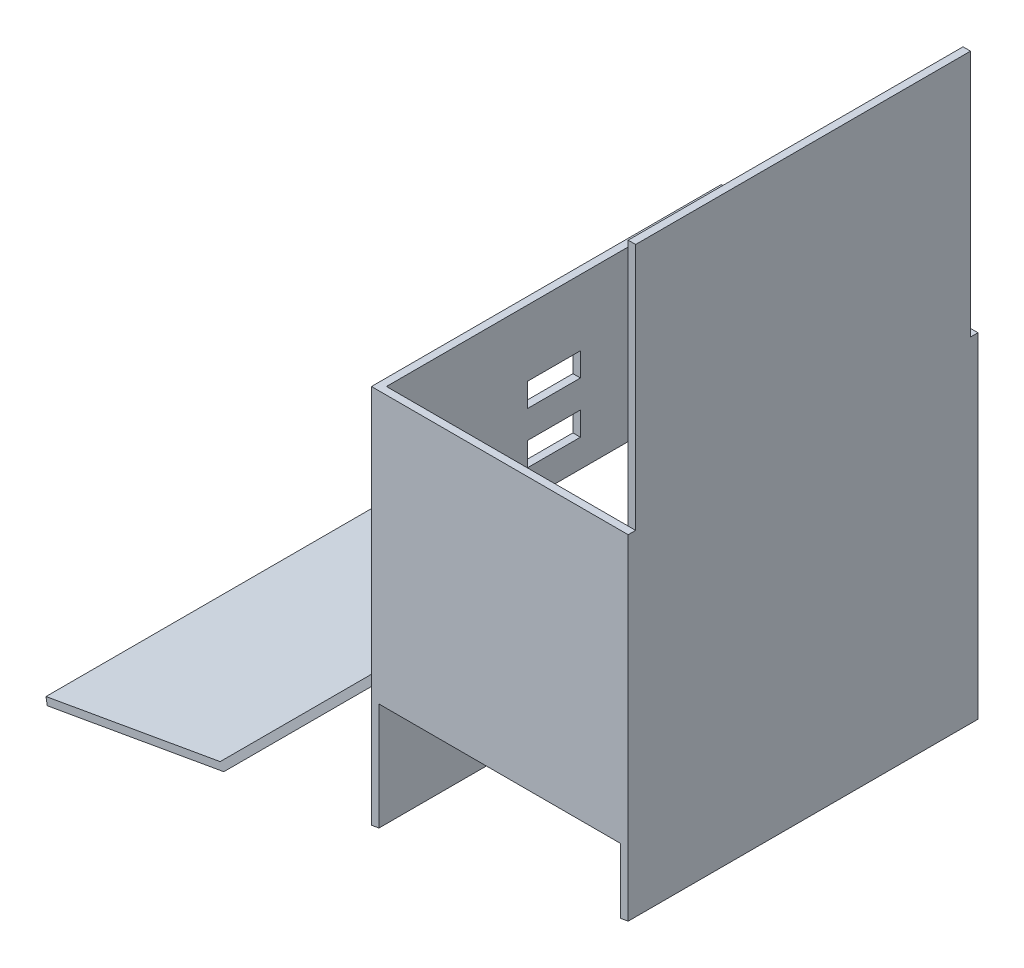
ISO-10303-21;
HEADER;
FILE_DESCRIPTION(('STEP AP214'),'2;1');
FILE_NAME('part.step','',(''),(''),'','','');
FILE_SCHEMA(('AUTOMOTIVE_DESIGN { 1 0 10303 214 1 1 1 1 }'));
ENDSEC;
DATA;
#1=APPLICATION_CONTEXT('core data for automotive mechanical design processes');
#2=APPLICATION_PROTOCOL_DEFINITION('international standard','automotive_design',2000,#1);
#3=PRODUCT_CONTEXT('',#1,'mechanical');
#4=PRODUCT('Part','Part','',(#3));
#5=PRODUCT_RELATED_PRODUCT_CATEGORY('part','',(#4));
#6=PRODUCT_DEFINITION_FORMATION('','',#4);
#7=PRODUCT_DEFINITION_CONTEXT('part definition',#1,'design');
#8=PRODUCT_DEFINITION('design','',#6,#7);
#9=PRODUCT_DEFINITION_SHAPE('','',#8);
#10=(LENGTH_UNIT() NAMED_UNIT(*) SI_UNIT(.MILLI.,.METRE.));
#11=(NAMED_UNIT(*) PLANE_ANGLE_UNIT() SI_UNIT($,.RADIAN.));
#12=(NAMED_UNIT(*) SI_UNIT($,.STERADIAN.) SOLID_ANGLE_UNIT());
#13=UNCERTAINTY_MEASURE_WITH_UNIT(LENGTH_MEASURE(1.E-05),#10,'distance_accuracy_value','');
#14=(GEOMETRIC_REPRESENTATION_CONTEXT(3) GLOBAL_UNCERTAINTY_ASSIGNED_CONTEXT((#13)) GLOBAL_UNIT_ASSIGNED_CONTEXT((#10,
#11,#12)) REPRESENTATION_CONTEXT('',''));
#15=CARTESIAN_POINT('',(0.,0.,0.));
#16=DIRECTION('',(0.,0.,1.));
#17=DIRECTION('',(1.,0.,0.));
#18=AXIS2_PLACEMENT_3D('',#15,#16,#17);
#19=CARTESIAN_POINT('',(-108.85,-673.912258561137,-148.35));
#20=DIRECTION('',(0.,0.,-1.));
#21=DIRECTION('',(-1.,0.,0.));
#22=AXIS2_PLACEMENT_3D('',#19,#20,#21);
#23=PLANE('',#22);
#24=DIRECTION('',(1.,0.,0.));
#25=VECTOR('',#24,1.);
#26=CARTESIAN_POINT('',(-108.85,-230.,-148.35));
#27=LINE('',#26,#25);
#28=CARTESIAN_POINT('',(-102.5,-230.,-148.35));
#29=VERTEX_POINT('',#28);
#30=CARTESIAN_POINT('',(102.5,-230.,-148.35));
#31=VERTEX_POINT('',#30);
#32=EDGE_CURVE('E280',#29,#31,#27,.T.);
#33=ORIENTED_EDGE('',*,*,#32,.F.);
#34=DIRECTION('',(0.,-1.,0.));
#35=VECTOR('',#34,1.);
#36=CARTESIAN_POINT('',(-102.5,-673.912258561137,-148.35));
#37=LINE('',#36,#35);
#38=CARTESIAN_POINT('',(-102.5,-321.147031045235,-148.35));
#39=VERTEX_POINT('',#38);
#40=EDGE_CURVE('E779',#29,#39,#37,.T.);
#41=ORIENTED_EDGE('',*,*,#40,.T.);
#42=DIRECTION('',(0.984807753012208,0.173648177666931,0.));
#43=VECTOR('',#42,1.);
#44=CARTESIAN_POINT('',(-168.984930908646,-332.870118174968,-148.35));
#45=LINE('',#44,#43);
#46=CARTESIAN_POINT('',(-108.85,-322.266707372734,-148.35));
#47=VERTEX_POINT('',#46);
#48=EDGE_CURVE('E11',#47,#39,#45,.T.);
#49=ORIENTED_EDGE('',*,*,#48,.F.);
#50=DIRECTION('',(0.,1.,0.));
#51=VECTOR('',#50,1.);
#52=CARTESIAN_POINT('',(-108.85,-673.912258561137,-148.35));
#53=LINE('',#52,#51);
#54=CARTESIAN_POINT('',(-108.85,0.,-148.35));
#55=VERTEX_POINT('',#54);
#56=EDGE_CURVE('E502',#47,#55,#53,.T.);
#57=ORIENTED_EDGE('',*,*,#56,.T.);
#58=DIRECTION('',(-1.,0.,0.));
#59=VECTOR('',#58,1.);
#60=CARTESIAN_POINT('',(-108.85,0.,-148.35));
#61=LINE('',#60,#59);
#62=CARTESIAN_POINT('',(108.85,0.,-148.35));
#63=VERTEX_POINT('',#62);
#64=EDGE_CURVE('E491',#63,#55,#61,.T.);
#65=ORIENTED_EDGE('',*,*,#64,.F.);
#66=DIRECTION('',(0.,1.,0.));
#67=VECTOR('',#66,1.);
#68=CARTESIAN_POINT('',(108.85,-673.912258561137,-148.35));
#69=LINE('',#68,#67);
#70=CARTESIAN_POINT('',(108.85,-283.880323672501,-148.35));
#71=VERTEX_POINT('',#70);
#72=EDGE_CURVE('E43',#71,#63,#69,.T.);
#73=ORIENTED_EDGE('',*,*,#72,.F.);
#74=CARTESIAN_POINT('',(102.5,-285.,-148.35));
#75=VERTEX_POINT('',#74);
#76=EDGE_CURVE('E48',#75,#71,#45,.T.);
#77=ORIENTED_EDGE('',*,*,#76,.F.);
#78=DIRECTION('',(0.,1.,0.));
#79=VECTOR('',#78,1.);
#80=CARTESIAN_POINT('',(102.5,-673.912258561137,-148.35));
#81=LINE('',#80,#79);
#82=EDGE_CURVE('E265',#75,#31,#81,.T.);
#83=ORIENTED_EDGE('',*,*,#82,.T.);
#84=EDGE_LOOP('',(#33,#41,#49,#57,#65,#73,#77,#83));
#85=FACE_BOUND('',#84,.T.);
#86=ADVANCED_FACE('F39',(#85),#23,.T.);
#87=CARTESIAN_POINT('',(-108.85,-673.912258561137,148.35));
#88=DIRECTION('',(0.,0.,1.));
#89=DIRECTION('',(1.,0.,0.));
#90=AXIS2_PLACEMENT_3D('',#87,#88,#89);
#91=PLANE('',#90);
#92=DIRECTION('',(-0.984807753012208,-0.173648177666931,0.));
#93=VECTOR('',#92,1.);
#94=CARTESIAN_POINT('',(-168.984930908646,-332.870118174968,148.35));
#95=LINE('',#94,#93);
#96=CARTESIAN_POINT('',(-102.5,-321.147031045235,148.35));
#97=VERTEX_POINT('',#96);
#98=CARTESIAN_POINT('',(-108.85,-322.266707372734,148.35));
#99=VERTEX_POINT('',#98);
#100=EDGE_CURVE('E462',#97,#99,#95,.T.);
#101=ORIENTED_EDGE('',*,*,#100,.F.);
#102=DIRECTION('',(0.,1.,0.));
#103=VECTOR('',#102,1.);
#104=CARTESIAN_POINT('',(-102.5,-673.912258561137,148.35));
#105=LINE('',#104,#103);
#106=CARTESIAN_POINT('',(-102.5,-230.,148.35));
#107=VERTEX_POINT('',#106);
#108=EDGE_CURVE('E279',#97,#107,#105,.T.);
#109=ORIENTED_EDGE('',*,*,#108,.T.);
#110=DIRECTION('',(-1.,0.,0.));
#111=VECTOR('',#110,1.);
#112=CARTESIAN_POINT('',(-108.85,-230.,148.35));
#113=LINE('',#112,#111);
#114=CARTESIAN_POINT('',(102.5,-230.,148.35));
#115=VERTEX_POINT('',#114);
#116=EDGE_CURVE('E269',#115,#107,#113,.T.);
#117=ORIENTED_EDGE('',*,*,#116,.F.);
#118=DIRECTION('',(0.,-1.,0.));
#119=VECTOR('',#118,1.);
#120=CARTESIAN_POINT('',(102.5,-673.912258561137,148.35));
#121=LINE('',#120,#119);
#122=CARTESIAN_POINT('',(102.5,-285.,148.35));
#123=VERTEX_POINT('',#122);
#124=EDGE_CURVE('E256',#115,#123,#121,.T.);
#125=ORIENTED_EDGE('',*,*,#124,.T.);
#126=CARTESIAN_POINT('',(108.85,-283.880323672501,148.35));
#127=VERTEX_POINT('',#126);
#128=EDGE_CURVE('E464',#127,#123,#95,.T.);
#129=ORIENTED_EDGE('',*,*,#128,.F.);
#130=DIRECTION('',(0.,1.,0.));
#131=VECTOR('',#130,1.);
#132=CARTESIAN_POINT('',(108.85,-673.912258561137,148.35));
#133=LINE('',#132,#131);
#134=CARTESIAN_POINT('',(108.85,0.,148.35));
#135=VERTEX_POINT('',#134);
#136=EDGE_CURVE('E463',#127,#135,#133,.T.);
#137=ORIENTED_EDGE('',*,*,#136,.T.);
#138=DIRECTION('',(1.,0.,0.));
#139=VECTOR('',#138,1.);
#140=CARTESIAN_POINT('',(-108.85,0.,148.35));
#141=LINE('',#140,#139);
#142=CARTESIAN_POINT('',(-108.85,0.,148.35));
#143=VERTEX_POINT('',#142);
#144=EDGE_CURVE('E497',#143,#135,#141,.T.);
#145=ORIENTED_EDGE('',*,*,#144,.F.);
#146=DIRECTION('',(0.,1.,0.));
#147=VECTOR('',#146,1.);
#148=CARTESIAN_POINT('',(-108.85,-673.912258561137,148.35));
#149=LINE('',#148,#147);
#150=EDGE_CURVE('E501',#99,#143,#149,.T.);
#151=ORIENTED_EDGE('',*,*,#150,.F.);
#152=EDGE_LOOP('',(#101,#109,#117,#125,#129,#137,#145,#151));
#153=FACE_BOUND('',#152,.T.);
#154=ADVANCED_FACE('F277',(#153),#91,.T.);
#155=CARTESIAN_POINT('',(51.8286236086301,-293.934730807433,0.));
#156=DIRECTION('',(-0.173648177666931,0.984807753012208,0.));
#157=DIRECTION('',(-0.984807753012208,-0.173648177666931,0.));
#158=AXIS2_PLACEMENT_3D('',#155,#156,#157);
#159=PLANE('',#158);
#160=DIRECTION('',(0.,0.,-1.));
#161=VECTOR('',#160,1.);
#162=CARTESIAN_POINT('',(-102.5,-321.147031045235,-142.));
#163=LINE('',#162,#161);
#164=EDGE_CURVE('E456',#97,#39,#163,.T.);
#165=ORIENTED_EDGE('',*,*,#164,.F.);
#166=ORIENTED_EDGE('',*,*,#100,.T.);
#167=DIRECTION('',(0.,0.,-1.));
#168=VECTOR('',#167,1.);
#169=CARTESIAN_POINT('',(-108.85,-322.266707372734,-148.35));
#170=LINE('',#169,#168);
#171=EDGE_CURVE('E460',#99,#47,#170,.T.);
#172=ORIENTED_EDGE('',*,*,#171,.T.);
#173=ORIENTED_EDGE('',*,*,#48,.T.);
#174=EDGE_LOOP('',(#165,#166,#172,#173));
#175=FACE_BOUND('',#174,.T.);
#176=ADVANCED_FACE('F606',(#175),#159,.F.);
#177=DIRECTION('',(0.,0.,1.));
#178=VECTOR('',#177,1.);
#179=CARTESIAN_POINT('',(102.5,-285.,-142.));
#180=LINE('',#179,#178);
#181=EDGE_CURVE('E56',#75,#123,#180,.T.);
#182=ORIENTED_EDGE('',*,*,#181,.F.);
#183=ORIENTED_EDGE('',*,*,#76,.T.);
#184=DIRECTION('',(0.,0.,1.));
#185=VECTOR('',#184,1.);
#186=CARTESIAN_POINT('',(108.85,-283.880323672501,-148.35));
#187=LINE('',#186,#185);
#188=EDGE_CURVE('E458',#71,#127,#187,.T.);
#189=ORIENTED_EDGE('',*,*,#188,.T.);
#190=ORIENTED_EDGE('',*,*,#128,.T.);
#191=EDGE_LOOP('',(#182,#183,#189,#190));
#192=FACE_BOUND('',#191,.T.);
#193=ADVANCED_FACE('F575',(#192),#159,.F.);
#194=CARTESIAN_POINT('',(-102.5,-673.912258561137,-142.));
#195=DIRECTION('',(-1.,0.,0.));
#196=DIRECTION('',(0.,0.,1.));
#197=AXIS2_PLACEMENT_3D('',#194,#195,#196);
#198=PLANE('',#197);
#199=DIRECTION('',(0.,1.,0.));
#200=VECTOR('',#199,1.);
#201=CARTESIAN_POINT('',(-102.5,-55.9999999999999,-22.5));
#202=LINE('',#201,#200);
#203=CARTESIAN_POINT('',(-102.5,-75.9999999999999,-22.5));
#204=VERTEX_POINT('',#203);
#205=CARTESIAN_POINT('',(-102.5,-55.9999999999999,-22.5));
#206=VERTEX_POINT('',#205);
#207=EDGE_CURVE('E349',#204,#206,#202,.T.);
#208=ORIENTED_EDGE('',*,*,#207,.F.);
#209=DIRECTION('',(0.,0.,1.));
#210=VECTOR('',#209,1.);
#211=CARTESIAN_POINT('',(-102.5,-75.9999999999999,-22.5));
#212=LINE('',#211,#210);
#213=CARTESIAN_POINT('',(-102.5,-75.9999999999999,22.5));
#214=VERTEX_POINT('',#213);
#215=EDGE_CURVE('E327',#204,#214,#212,.T.);
#216=ORIENTED_EDGE('',*,*,#215,.T.);
#217=DIRECTION('',(0.,1.,0.));
#218=VECTOR('',#217,1.);
#219=CARTESIAN_POINT('',(-102.5,-55.9999999999999,22.5));
#220=LINE('',#219,#218);
#221=CARTESIAN_POINT('',(-102.5,-55.9999999999999,22.5));
#222=VERTEX_POINT('',#221);
#223=EDGE_CURVE('E338',#214,#222,#220,.T.);
#224=ORIENTED_EDGE('',*,*,#223,.T.);
#225=DIRECTION('',(0.,0.,1.));
#226=VECTOR('',#225,1.);
#227=CARTESIAN_POINT('',(-102.5,-55.9999999999999,-22.5));
#228=LINE('',#227,#226);
#229=EDGE_CURVE('E330',#206,#222,#228,.T.);
#230=ORIENTED_EDGE('',*,*,#229,.F.);
#231=EDGE_LOOP('',(#208,#216,#224,#230));
#232=FACE_BOUND('',#231,.T.);
#233=DIRECTION('',(0.,1.,0.));
#234=VECTOR('',#233,1.);
#235=CARTESIAN_POINT('',(-102.5,-673.912258561137,142.));
#236=LINE('',#235,#234);
#237=CARTESIAN_POINT('',(-102.5,-143.,142.));
#238=VERTEX_POINT('',#237);
#239=CARTESIAN_POINT('',(-102.5,0.,142.));
#240=VERTEX_POINT('',#239);
#241=EDGE_CURVE('E484',#238,#240,#236,.T.);
#242=ORIENTED_EDGE('',*,*,#241,.F.);
#243=DIRECTION('',(0.,0.,1.));
#244=VECTOR('',#243,1.);
#245=CARTESIAN_POINT('',(-102.5,-143.,-210.644336984197));
#246=LINE('',#245,#244);
#247=CARTESIAN_POINT('',(-102.5,-143.,-142.));
#248=VERTEX_POINT('',#247);
#249=EDGE_CURVE('E359',#248,#238,#246,.T.);
#250=ORIENTED_EDGE('',*,*,#249,.F.);
#251=DIRECTION('',(0.,1.,0.));
#252=VECTOR('',#251,1.);
#253=CARTESIAN_POINT('',(-102.5,-673.912258561137,-142.));
#254=LINE('',#253,#252);
#255=CARTESIAN_POINT('',(-102.5,0.,-142.));
#256=VERTEX_POINT('',#255);
#257=EDGE_CURVE('E487',#248,#256,#254,.T.);
#258=ORIENTED_EDGE('',*,*,#257,.T.);
#259=DIRECTION('',(0.,0.,1.));
#260=VECTOR('',#259,1.);
#261=CARTESIAN_POINT('',(-102.5,0.,-142.));
#262=LINE('',#261,#260);
#263=EDGE_CURVE('E472',#256,#240,#262,.T.);
#264=ORIENTED_EDGE('',*,*,#263,.T.);
#265=EDGE_LOOP('',(#242,#250,#258,#264));
#266=FACE_BOUND('',#265,.T.);
#267=DIRECTION('',(0.,1.,0.));
#268=VECTOR('',#267,1.);
#269=CARTESIAN_POINT('',(-102.5,-99.4999999999999,-22.5));
#270=LINE('',#269,#268);
#271=CARTESIAN_POINT('',(-102.5,-119.5,-22.5));
#272=VERTEX_POINT('',#271);
#273=CARTESIAN_POINT('',(-102.5,-99.4999999999999,-22.5));
#274=VERTEX_POINT('',#273);
#275=EDGE_CURVE('E295',#272,#274,#270,.T.);
#276=ORIENTED_EDGE('',*,*,#275,.F.);
#277=DIRECTION('',(0.,0.,1.));
#278=VECTOR('',#277,1.);
#279=CARTESIAN_POINT('',(-102.5,-119.5,-22.5));
#280=LINE('',#279,#278);
#281=CARTESIAN_POINT('',(-102.5,-119.5,22.5));
#282=VERTEX_POINT('',#281);
#283=EDGE_CURVE('E318',#272,#282,#280,.T.);
#284=ORIENTED_EDGE('',*,*,#283,.T.);
#285=DIRECTION('',(0.,1.,0.));
#286=VECTOR('',#285,1.);
#287=CARTESIAN_POINT('',(-102.5,-99.4999999999999,22.5));
#288=LINE('',#287,#286);
#289=CARTESIAN_POINT('',(-102.5,-99.4999999999999,22.5));
#290=VERTEX_POINT('',#289);
#291=EDGE_CURVE('E308',#282,#290,#288,.T.);
#292=ORIENTED_EDGE('',*,*,#291,.T.);
#293=DIRECTION('',(0.,0.,1.));
#294=VECTOR('',#293,1.);
#295=CARTESIAN_POINT('',(-102.5,-99.4999999999999,-22.5));
#296=LINE('',#295,#294);
#297=EDGE_CURVE('E316',#274,#290,#296,.T.);
#298=ORIENTED_EDGE('',*,*,#297,.F.);
#299=EDGE_LOOP('',(#276,#284,#292,#298));
#300=FACE_BOUND('',#299,.T.);
#301=ADVANCED_FACE('F572',(#232,#266,#300),#198,.F.);
#302=CARTESIAN_POINT('',(-108.85,-673.912258561137,-148.35));
#303=DIRECTION('',(-1.,0.,0.));
#304=DIRECTION('',(0.,0.,1.));
#305=AXIS2_PLACEMENT_3D('',#302,#303,#304);
#306=PLANE('',#305);
#307=DIRECTION('',(0.,-1.,0.));
#308=VECTOR('',#307,1.);
#309=CARTESIAN_POINT('',(-108.85,-211.35,-142.));
#310=LINE('',#309,#308);
#311=CARTESIAN_POINT('',(-108.85,-143.,-142.));
#312=VERTEX_POINT('',#311);
#313=CARTESIAN_POINT('',(-108.85,-211.35,-142.));
#314=VERTEX_POINT('',#313);
#315=EDGE_CURVE('E362',#312,#314,#310,.T.);
#316=ORIENTED_EDGE('',*,*,#315,.F.);
#317=DIRECTION('',(0.,0.,1.));
#318=VECTOR('',#317,1.);
#319=CARTESIAN_POINT('',(-108.85,-143.,-210.644336984197));
#320=LINE('',#319,#318);
#321=CARTESIAN_POINT('',(-108.85,-143.,142.));
#322=VERTEX_POINT('',#321);
#323=EDGE_CURVE('E366',#312,#322,#320,.T.);
#324=ORIENTED_EDGE('',*,*,#323,.T.);
#325=DIRECTION('',(0.,-1.,0.));
#326=VECTOR('',#325,1.);
#327=CARTESIAN_POINT('',(-108.85,-211.35,142.));
#328=LINE('',#327,#326);
#329=CARTESIAN_POINT('',(-108.85,-211.35,142.));
#330=VERTEX_POINT('',#329);
#331=EDGE_CURVE('E356',#322,#330,#328,.T.);
#332=ORIENTED_EDGE('',*,*,#331,.T.);
#333=DIRECTION('',(0.,1.,0.));
#334=VECTOR('',#333,1.);
#335=CARTESIAN_POINT('',(-108.85,-673.912258561137,142.));
#336=LINE('',#335,#334);
#337=CARTESIAN_POINT('',(-108.85,-220.330256121069,142.));
#338=VERTEX_POINT('',#337);
#339=EDGE_CURVE('E438',#338,#330,#336,.T.);
#340=ORIENTED_EDGE('',*,*,#339,.F.);
#341=DIRECTION('',(0.,0.,1.));
#342=VECTOR('',#341,1.);
#343=CARTESIAN_POINT('',(-108.85,-220.330256121069,-148.35));
#344=LINE('',#343,#342);
#345=CARTESIAN_POINT('',(-108.85,-220.330256121069,-142.));
#346=VERTEX_POINT('',#345);
#347=EDGE_CURVE('E449',#346,#338,#344,.T.);
#348=ORIENTED_EDGE('',*,*,#347,.F.);
#349=DIRECTION('',(0.,-1.,0.));
#350=VECTOR('',#349,1.);
#351=CARTESIAN_POINT('',(-108.85,-673.912258561137,-142.));
#352=LINE('',#351,#350);
#353=EDGE_CURVE('E452',#314,#346,#352,.T.);
#354=ORIENTED_EDGE('',*,*,#353,.F.);
#355=EDGE_LOOP('',(#316,#324,#332,#340,#348,#354));
#356=FACE_BOUND('',#355,.T.);
#357=ORIENTED_EDGE('',*,*,#171,.F.);
#358=ORIENTED_EDGE('',*,*,#150,.T.);
#359=DIRECTION('',(0.,0.,1.));
#360=VECTOR('',#359,1.);
#361=CARTESIAN_POINT('',(-108.85,0.,-148.35));
#362=LINE('',#361,#360);
#363=EDGE_CURVE('E494',#55,#143,#362,.T.);
#364=ORIENTED_EDGE('',*,*,#363,.F.);
#365=ORIENTED_EDGE('',*,*,#56,.F.);
#366=EDGE_LOOP('',(#357,#358,#364,#365));
#367=FACE_BOUND('',#366,.T.);
#368=DIRECTION('',(0.,0.,1.));
#369=VECTOR('',#368,1.);
#370=CARTESIAN_POINT('',(-108.85,-75.9999999999999,-22.5));
#371=LINE('',#370,#369);
#372=CARTESIAN_POINT('',(-108.85,-75.9999999999999,-22.5));
#373=VERTEX_POINT('',#372);
#374=CARTESIAN_POINT('',(-108.85,-75.9999999999998,22.5));
#375=VERTEX_POINT('',#374);
#376=EDGE_CURVE('E323',#373,#375,#371,.T.);
#377=ORIENTED_EDGE('',*,*,#376,.F.);
#378=DIRECTION('',(0.,-1.,0.));
#379=VECTOR('',#378,1.);
#380=CARTESIAN_POINT('',(-108.85,-55.9999999999999,-22.5));
#381=LINE('',#380,#379);
#382=CARTESIAN_POINT('',(-108.85,-55.9999999999999,-22.5));
#383=VERTEX_POINT('',#382);
#384=EDGE_CURVE('E339',#383,#373,#381,.T.);
#385=ORIENTED_EDGE('',*,*,#384,.F.);
#386=DIRECTION('',(0.,0.,1.));
#387=VECTOR('',#386,1.);
#388=CARTESIAN_POINT('',(-108.85,-55.9999999999999,-22.5));
#389=LINE('',#388,#387);
#390=CARTESIAN_POINT('',(-108.85,-55.9999999999999,22.5));
#391=VERTEX_POINT('',#390);
#392=EDGE_CURVE('E283',#383,#391,#389,.T.);
#393=ORIENTED_EDGE('',*,*,#392,.T.);
#394=DIRECTION('',(0.,-1.,0.));
#395=VECTOR('',#394,1.);
#396=CARTESIAN_POINT('',(-108.85,-55.9999999999999,22.5));
#397=LINE('',#396,#395);
#398=EDGE_CURVE('E305',#391,#375,#397,.T.);
#399=ORIENTED_EDGE('',*,*,#398,.T.);
#400=EDGE_LOOP('',(#377,#385,#393,#399));
#401=FACE_BOUND('',#400,.T.);
#402=DIRECTION('',(0.,0.,1.));
#403=VECTOR('',#402,1.);
#404=CARTESIAN_POINT('',(-108.85,-119.5,-22.5));
#405=LINE('',#404,#403);
#406=CARTESIAN_POINT('',(-108.85,-119.5,-22.5));
#407=VERTEX_POINT('',#406);
#408=CARTESIAN_POINT('',(-108.85,-119.5,22.5));
#409=VERTEX_POINT('',#408);
#410=EDGE_CURVE('E300',#407,#409,#405,.T.);
#411=ORIENTED_EDGE('',*,*,#410,.F.);
#412=DIRECTION('',(0.,-1.,0.));
#413=VECTOR('',#412,1.);
#414=CARTESIAN_POINT('',(-108.85,-99.4999999999999,-22.5));
#415=LINE('',#414,#413);
#416=CARTESIAN_POINT('',(-108.85,-99.4999999999999,-22.5));
#417=VERTEX_POINT('',#416);
#418=EDGE_CURVE('E289',#417,#407,#415,.T.);
#419=ORIENTED_EDGE('',*,*,#418,.F.);
#420=DIRECTION('',(0.,0.,1.));
#421=VECTOR('',#420,1.);
#422=CARTESIAN_POINT('',(-108.85,-99.4999999999999,-22.5));
#423=LINE('',#422,#421);
#424=CARTESIAN_POINT('',(-108.85,-99.4999999999999,22.5));
#425=VERTEX_POINT('',#424);
#426=EDGE_CURVE('E312',#417,#425,#423,.T.);
#427=ORIENTED_EDGE('',*,*,#426,.T.);
#428=DIRECTION('',(0.,-1.,0.));
#429=VECTOR('',#428,1.);
#430=CARTESIAN_POINT('',(-108.85,-99.4999999999999,22.5));
#431=LINE('',#430,#429);
#432=EDGE_CURVE('E301',#425,#409,#431,.T.);
#433=ORIENTED_EDGE('',*,*,#432,.T.);
#434=EDGE_LOOP('',(#411,#419,#427,#433));
#435=FACE_BOUND('',#434,.T.);
#436=ADVANCED_FACE('F554',(#356,#367,#401,#435),#306,.T.);
#437=CARTESIAN_POINT('',(-102.5,-673.912258561137,-142.));
#438=DIRECTION('',(0.,0.,-1.));
#439=DIRECTION('',(-1.,0.,0.));
#440=AXIS2_PLACEMENT_3D('',#437,#438,#439);
#441=PLANE('',#440);
#442=ORIENTED_EDGE('',*,*,#257,.F.);
#443=DIRECTION('',(-1.,0.,0.));
#444=VECTOR('',#443,1.);
#445=CARTESIAN_POINT('',(-108.85,-143.,-142.));
#446=LINE('',#445,#444);
#447=EDGE_CURVE('E367',#248,#312,#446,.T.);
#448=ORIENTED_EDGE('',*,*,#447,.T.);
#449=ORIENTED_EDGE('',*,*,#315,.T.);
#450=DIRECTION('',(-0.707106781186548,-0.707106781186548,0.));
#451=VECTOR('',#450,1.);
#452=CARTESIAN_POINT('',(102.5,0.,-142.));
#453=LINE('',#452,#451);
#454=CARTESIAN_POINT('',(102.5,0.,-142.));
#455=VERTEX_POINT('',#454);
#456=EDGE_CURVE('E416',#455,#314,#453,.T.);
#457=ORIENTED_EDGE('',*,*,#456,.F.);
#458=DIRECTION('',(-1.,0.,0.));
#459=VECTOR('',#458,1.);
#460=CARTESIAN_POINT('',(-102.5,0.,-142.));
#461=LINE('',#460,#459);
#462=EDGE_CURVE('E469',#455,#256,#461,.T.);
#463=ORIENTED_EDGE('',*,*,#462,.T.);
#464=EDGE_LOOP('',(#442,#448,#449,#457,#463));
#465=FACE_BOUND('',#464,.T.);
#466=ADVANCED_FACE('F567',(#465),#441,.F.);
#467=CARTESIAN_POINT('',(-102.5,-673.912258561137,142.));
#468=DIRECTION('',(0.,0.,1.));
#469=DIRECTION('',(1.,0.,0.));
#470=AXIS2_PLACEMENT_3D('',#467,#468,#469);
#471=PLANE('',#470);
#472=DIRECTION('',(1.,0.,0.));
#473=VECTOR('',#472,1.);
#474=CARTESIAN_POINT('',(-102.5,0.,142.));
#475=LINE('',#474,#473);
#476=CARTESIAN_POINT('',(102.5,0.,142.));
#477=VERTEX_POINT('',#476);
#478=EDGE_CURVE('E475',#240,#477,#475,.T.);
#479=ORIENTED_EDGE('',*,*,#478,.T.);
#480=DIRECTION('',(-0.707106781186548,-0.707106781186548,0.));
#481=VECTOR('',#480,1.);
#482=CARTESIAN_POINT('',(102.5,0.,142.));
#483=LINE('',#482,#481);
#484=EDGE_CURVE('E410',#477,#330,#483,.T.);
#485=ORIENTED_EDGE('',*,*,#484,.T.);
#486=ORIENTED_EDGE('',*,*,#331,.F.);
#487=DIRECTION('',(-1.,0.,0.));
#488=VECTOR('',#487,1.);
#489=CARTESIAN_POINT('',(-108.85,-143.,142.));
#490=LINE('',#489,#488);
#491=EDGE_CURVE('E315',#238,#322,#490,.T.);
#492=ORIENTED_EDGE('',*,*,#491,.F.);
#493=ORIENTED_EDGE('',*,*,#241,.T.);
#494=EDGE_LOOP('',(#479,#485,#486,#492,#493));
#495=FACE_BOUND('',#494,.T.);
#496=ADVANCED_FACE('F541',(#495),#471,.F.);
#497=CARTESIAN_POINT('',(108.85,-673.912258561137,-148.35));
#498=DIRECTION('',(1.,0.,0.));
#499=DIRECTION('',(0.,0.,-1.));
#500=AXIS2_PLACEMENT_3D('',#497,#498,#499);
#501=PLANE('',#500);
#502=ORIENTED_EDGE('',*,*,#188,.F.);
#503=ORIENTED_EDGE('',*,*,#72,.T.);
#504=DIRECTION('',(0.,0.,-1.));
#505=VECTOR('',#504,1.);
#506=CARTESIAN_POINT('',(108.85,0.,-148.35));
#507=LINE('',#506,#505);
#508=CARTESIAN_POINT('',(108.85,0.,-142.));
#509=VERTEX_POINT('',#508);
#510=EDGE_CURVE('E481',#509,#63,#507,.T.);
#511=ORIENTED_EDGE('',*,*,#510,.F.);
#512=DIRECTION('',(0.,-1.,0.));
#513=VECTOR('',#512,1.);
#514=CARTESIAN_POINT('',(108.85,210.,-142.));
#515=LINE('',#514,#513);
#516=CARTESIAN_POINT('',(108.85,210.,-142.));
#517=VERTEX_POINT('',#516);
#518=EDGE_CURVE('E390',#517,#509,#515,.T.);
#519=ORIENTED_EDGE('',*,*,#518,.F.);
#520=DIRECTION('',(0.,0.,-1.));
#521=VECTOR('',#520,1.);
#522=CARTESIAN_POINT('',(108.85,210.,-142.));
#523=LINE('',#522,#521);
#524=CARTESIAN_POINT('',(108.85,210.,142.));
#525=VERTEX_POINT('',#524);
#526=EDGE_CURVE('E379',#525,#517,#523,.T.);
#527=ORIENTED_EDGE('',*,*,#526,.F.);
#528=DIRECTION('',(0.,-1.,0.));
#529=VECTOR('',#528,1.);
#530=CARTESIAN_POINT('',(108.85,210.,142.));
#531=LINE('',#530,#529);
#532=CARTESIAN_POINT('',(108.85,0.,142.));
#533=VERTEX_POINT('',#532);
#534=EDGE_CURVE('E393',#525,#533,#531,.T.);
#535=ORIENTED_EDGE('',*,*,#534,.T.);
#536=EDGE_CURVE('E489',#135,#533,#507,.T.);
#537=ORIENTED_EDGE('',*,*,#536,.F.);
#538=ORIENTED_EDGE('',*,*,#136,.F.);
#539=EDGE_LOOP('',(#502,#503,#511,#519,#527,#535,#537,#538));
#540=FACE_BOUND('',#539,.T.);
#541=ADVANCED_FACE('F41',(#540),#501,.T.);
#542=CARTESIAN_POINT('',(0.,0.,0.));
#543=DIRECTION('',(0.,1.,0.));
#544=DIRECTION('',(0.,0.,1.));
#545=AXIS2_PLACEMENT_3D('',#542,#543,#544);
#546=PLANE('',#545);
#547=DIRECTION('',(-1.,0.,0.));
#548=VECTOR('',#547,1.);
#549=CARTESIAN_POINT('',(102.5,0.,-142.));
#550=LINE('',#549,#548);
#551=EDGE_CURVE('E377',#509,#455,#550,.T.);
#552=ORIENTED_EDGE('',*,*,#551,.F.);
#553=ORIENTED_EDGE('',*,*,#510,.T.);
#554=ORIENTED_EDGE('',*,*,#64,.T.);
#555=ORIENTED_EDGE('',*,*,#363,.T.);
#556=ORIENTED_EDGE('',*,*,#144,.T.);
#557=ORIENTED_EDGE('',*,*,#536,.T.);
#558=DIRECTION('',(1.,0.,0.));
#559=VECTOR('',#558,1.);
#560=CARTESIAN_POINT('',(102.5,0.,142.));
#561=LINE('',#560,#559);
#562=EDGE_CURVE('E365',#477,#533,#561,.T.);
#563=ORIENTED_EDGE('',*,*,#562,.F.);
#564=ORIENTED_EDGE('',*,*,#478,.F.);
#565=ORIENTED_EDGE('',*,*,#263,.F.);
#566=ORIENTED_EDGE('',*,*,#462,.F.);
#567=EDGE_LOOP('',(#552,#553,#554,#555,#556,#557,#563,#564,#565,#566));
#568=FACE_BOUND('',#567,.T.);
#569=ADVANCED_FACE('F518',(#568),#546,.T.);
#570=CARTESIAN_POINT('',(-102.5,-230.,-142.));
#571=VERTEX_POINT('',#570);
#572=CARTESIAN_POINT('',(-102.5,-213.980256121069,-142.));
#573=VERTEX_POINT('',#572);
#574=EDGE_CURVE('E485',#571,#573,#254,.T.);
#575=ORIENTED_EDGE('',*,*,#574,.F.);
#576=DIRECTION('',(1.,0.,0.));
#577=VECTOR('',#576,1.);
#578=CARTESIAN_POINT('',(-102.5,-230.,-142.));
#579=LINE('',#578,#577);
#580=CARTESIAN_POINT('',(102.5,-230.,-142.));
#581=VERTEX_POINT('',#580);
#582=EDGE_CURVE('E281',#571,#581,#579,.T.);
#583=ORIENTED_EDGE('',*,*,#582,.T.);
#584=DIRECTION('',(0.,1.,0.));
#585=VECTOR('',#584,1.);
#586=CARTESIAN_POINT('',(102.5,-673.912258561137,-142.));
#587=LINE('',#586,#585);
#588=CARTESIAN_POINT('',(102.5,-8.98025612106912,-142.));
#589=VERTEX_POINT('',#588);
#590=EDGE_CURVE('E478',#581,#589,#587,.T.);
#591=ORIENTED_EDGE('',*,*,#590,.T.);
#592=DIRECTION('',(0.707106781186548,0.707106781186548,0.));
#593=VECTOR('',#592,1.);
#594=CARTESIAN_POINT('',(102.5,-8.98025612106914,-142.));
#595=LINE('',#594,#593);
#596=EDGE_CURVE('E423',#573,#589,#595,.T.);
#597=ORIENTED_EDGE('',*,*,#596,.F.);
#598=EDGE_LOOP('',(#575,#583,#591,#597));
#599=FACE_BOUND('',#598,.T.);
#600=ADVANCED_FACE('F613',(#599),#441,.F.);
#601=CARTESIAN_POINT('',(-102.5,-230.,142.));
#602=VERTEX_POINT('',#601);
#603=CARTESIAN_POINT('',(-102.5,-213.980256121069,142.));
#604=VERTEX_POINT('',#603);
#605=EDGE_CURVE('E482',#602,#604,#236,.T.);
#606=ORIENTED_EDGE('',*,*,#605,.F.);
#607=DIRECTION('',(0.,0.,1.));
#608=VECTOR('',#607,1.);
#609=CARTESIAN_POINT('',(-102.5,-230.,-181.972850023145));
#610=LINE('',#609,#608);
#611=EDGE_CURVE('E785',#602,#107,#610,.T.);
#612=ORIENTED_EDGE('',*,*,#611,.T.);
#613=ORIENTED_EDGE('',*,*,#108,.F.);
#614=ORIENTED_EDGE('',*,*,#164,.T.);
#615=ORIENTED_EDGE('',*,*,#40,.F.);
#616=EDGE_CURVE('E774',#29,#571,#610,.T.);
#617=ORIENTED_EDGE('',*,*,#616,.T.);
#618=ORIENTED_EDGE('',*,*,#574,.T.);
#619=DIRECTION('',(0.,0.,1.));
#620=VECTOR('',#619,1.);
#621=CARTESIAN_POINT('',(-102.5,-213.980256121069,-142.));
#622=LINE('',#621,#620);
#623=EDGE_CURVE('E446',#573,#604,#622,.T.);
#624=ORIENTED_EDGE('',*,*,#623,.T.);
#625=EDGE_LOOP('',(#606,#612,#613,#614,#615,#617,#618,#624));
#626=FACE_BOUND('',#625,.T.);
#627=ADVANCED_FACE('F578',(#626),#198,.F.);
#628=DIRECTION('',(0.,1.,0.));
#629=VECTOR('',#628,1.);
#630=CARTESIAN_POINT('',(102.5,-673.912258561137,142.));
#631=LINE('',#630,#629);
#632=CARTESIAN_POINT('',(102.5,-230.,142.));
#633=VERTEX_POINT('',#632);
#634=CARTESIAN_POINT('',(102.5,-8.98025612106914,142.));
#635=VERTEX_POINT('',#634);
#636=EDGE_CURVE('E479',#633,#635,#631,.T.);
#637=ORIENTED_EDGE('',*,*,#636,.F.);
#638=DIRECTION('',(-1.,0.,0.));
#639=VECTOR('',#638,1.);
#640=CARTESIAN_POINT('',(-102.5,-230.,142.));
#641=LINE('',#640,#639);
#642=EDGE_CURVE('E272',#633,#602,#641,.T.);
#643=ORIENTED_EDGE('',*,*,#642,.T.);
#644=ORIENTED_EDGE('',*,*,#605,.T.);
#645=DIRECTION('',(0.707106781186548,0.707106781186548,0.));
#646=VECTOR('',#645,1.);
#647=CARTESIAN_POINT('',(102.5,-8.98025612106914,142.));
#648=LINE('',#647,#646);
#649=EDGE_CURVE('E399',#604,#635,#648,.T.);
#650=ORIENTED_EDGE('',*,*,#649,.T.);
#651=EDGE_LOOP('',(#637,#643,#644,#650));
#652=FACE_BOUND('',#651,.T.);
#653=ADVANCED_FACE('F617',(#652),#471,.F.);
#654=CARTESIAN_POINT('',(102.5,-673.912258561137,-142.));
#655=DIRECTION('',(1.,0.,0.));
#656=DIRECTION('',(0.,0.,-1.));
#657=AXIS2_PLACEMENT_3D('',#654,#655,#656);
#658=PLANE('',#657);
#659=ORIENTED_EDGE('',*,*,#590,.F.);
#660=DIRECTION('',(0.,0.,-1.));
#661=VECTOR('',#660,1.);
#662=CARTESIAN_POINT('',(102.5,-230.,-181.972850023145));
#663=LINE('',#662,#661);
#664=EDGE_CURVE('E273',#581,#31,#663,.T.);
#665=ORIENTED_EDGE('',*,*,#664,.T.);
#666=ORIENTED_EDGE('',*,*,#82,.F.);
#667=ORIENTED_EDGE('',*,*,#181,.T.);
#668=ORIENTED_EDGE('',*,*,#124,.F.);
#669=EDGE_CURVE('E260',#115,#633,#663,.T.);
#670=ORIENTED_EDGE('',*,*,#669,.T.);
#671=ORIENTED_EDGE('',*,*,#636,.T.);
#672=DIRECTION('',(0.,0.,1.));
#673=VECTOR('',#672,1.);
#674=CARTESIAN_POINT('',(102.5,-8.98025612106914,-764.005942105797));
#675=LINE('',#674,#673);
#676=EDGE_CURVE('E422',#589,#635,#675,.T.);
#677=ORIENTED_EDGE('',*,*,#676,.F.);
#678=EDGE_LOOP('',(#659,#665,#666,#667,#668,#670,#671,#677));
#679=FACE_BOUND('',#678,.T.);
#680=ADVANCED_FACE('F259',(#679),#658,.F.);
#681=CARTESIAN_POINT('',(102.5,-8.98025612106914,-764.005942105797));
#682=DIRECTION('',(0.707106781186548,-0.707106781186548,0.));
#683=DIRECTION('',(0.707106781186548,0.707106781186548,0.));
#684=AXIS2_PLACEMENT_3D('',#681,#682,#683);
#685=PLANE('',#684);
#686=ORIENTED_EDGE('',*,*,#623,.F.);
#687=ORIENTED_EDGE('',*,*,#596,.T.);
#688=ORIENTED_EDGE('',*,*,#676,.T.);
#689=ORIENTED_EDGE('',*,*,#649,.F.);
#690=EDGE_LOOP('',(#686,#687,#688,#689));
#691=FACE_BOUND('',#690,.T.);
#692=ADVANCED_FACE('F616',(#691),#685,.T.);
#693=CARTESIAN_POINT('',(102.5,0.,-764.005942105797));
#694=DIRECTION('',(-0.707106781186548,0.707106781186548,0.));
#695=DIRECTION('',(-0.707106781186548,-0.707106781186548,0.));
#696=AXIS2_PLACEMENT_3D('',#693,#694,#695);
#697=PLANE('',#696);
#698=ORIENTED_EDGE('',*,*,#456,.T.);
#699=CARTESIAN_POINT('',(-243.511090960752,-346.011090960752,-142.));
#700=VERTEX_POINT('',#699);
#701=EDGE_CURVE('E403',#314,#700,#453,.T.);
#702=ORIENTED_EDGE('',*,*,#701,.T.);
#703=DIRECTION('',(0.,0.,1.));
#704=VECTOR('',#703,1.);
#705=CARTESIAN_POINT('',(-243.511090960752,-346.011090960752,-764.005942105797));
#706=LINE('',#705,#704);
#707=CARTESIAN_POINT('',(-243.511090960752,-346.011090960752,142.));
#708=VERTEX_POINT('',#707);
#709=EDGE_CURVE('E418',#700,#708,#706,.T.);
#710=ORIENTED_EDGE('',*,*,#709,.T.);
#711=EDGE_CURVE('E412',#330,#708,#483,.T.);
#712=ORIENTED_EDGE('',*,*,#711,.F.);
#713=ORIENTED_EDGE('',*,*,#484,.F.);
#714=DIRECTION('',(0.,0.,-1.));
#715=VECTOR('',#714,1.);
#716=CARTESIAN_POINT('',(102.5,0.,-142.));
#717=LINE('',#716,#715);
#718=EDGE_CURVE('E455',#477,#455,#717,.T.);
#719=ORIENTED_EDGE('',*,*,#718,.T.);
#720=EDGE_LOOP('',(#698,#702,#710,#712,#713,#719));
#721=FACE_BOUND('',#720,.T.);
#722=ADVANCED_FACE('F546',(#721),#697,.T.);
#723=CARTESIAN_POINT('',(-102.5,-673.912258561137,-142.));
#724=DIRECTION('',(0.,0.,-1.));
#725=DIRECTION('',(-1.,0.,0.));
#726=AXIS2_PLACEMENT_3D('',#723,#724,#725);
#727=PLANE('',#726);
#728=ORIENTED_EDGE('',*,*,#701,.F.);
#729=ORIENTED_EDGE('',*,*,#353,.T.);
#730=CARTESIAN_POINT('',(-240.436694839615,-351.916950960684,-142.));
#731=VERTEX_POINT('',#730);
#732=EDGE_CURVE('E419',#731,#346,#595,.T.);
#733=ORIENTED_EDGE('',*,*,#732,.F.);
#734=DIRECTION('',(0.984807753012208,0.173648177666931,0.));
#735=VECTOR('',#734,1.);
#736=CARTESIAN_POINT('',(-390.129587984398,-378.311846842419,-142.));
#737=LINE('',#736,#735);
#738=CARTESIAN_POINT('',(-390.129587984398,-378.311846842419,-142.));
#739=VERTEX_POINT('',#738);
#740=EDGE_CURVE('E424',#739,#731,#737,.T.);
#741=ORIENTED_EDGE('',*,*,#740,.F.);
#742=DIRECTION('',(0.173648177666934,-0.984807753012208,0.));
#743=VECTOR('',#742,1.);
#744=CARTESIAN_POINT('',(-391.232253912583,-372.058317610791,-142.));
#745=LINE('',#744,#743);
#746=CARTESIAN_POINT('',(-391.232253912583,-372.058317610791,-142.));
#747=VERTEX_POINT('',#746);
#748=EDGE_CURVE('E429',#747,#739,#745,.T.);
#749=ORIENTED_EDGE('',*,*,#748,.F.);
#750=DIRECTION('',(-0.984807753012208,-0.17364817766693,0.));
#751=VECTOR('',#750,1.);
#752=CARTESIAN_POINT('',(-243.511090960752,-346.011090960752,-142.));
#753=LINE('',#752,#751);
#754=EDGE_CURVE('E433',#700,#747,#753,.T.);
#755=ORIENTED_EDGE('',*,*,#754,.F.);
#756=EDGE_LOOP('',(#728,#729,#733,#741,#749,#755));
#757=FACE_BOUND('',#756,.T.);
#758=ADVANCED_FACE('F562',(#757),#727,.T.);
#759=CARTESIAN_POINT('',(-243.511090960752,-346.011090960752,-764.005942105797));
#760=DIRECTION('',(-0.17364817766693,0.984807753012208,0.));
#761=DIRECTION('',(-0.984807753012208,-0.17364817766693,0.));
#762=AXIS2_PLACEMENT_3D('',#759,#760,#761);
#763=PLANE('',#762);
#764=ORIENTED_EDGE('',*,*,#709,.F.);
#765=ORIENTED_EDGE('',*,*,#754,.T.);
#766=DIRECTION('',(0.,0.,1.));
#767=VECTOR('',#766,1.);
#768=CARTESIAN_POINT('',(-391.232253912583,-372.058317610791,-764.005942105797));
#769=LINE('',#768,#767);
#770=CARTESIAN_POINT('',(-391.232253912583,-372.058317610791,142.));
#771=VERTEX_POINT('',#770);
#772=EDGE_CURVE('E432',#747,#771,#769,.T.);
#773=ORIENTED_EDGE('',*,*,#772,.T.);
#774=DIRECTION('',(-0.984807753012208,-0.17364817766693,0.));
#775=VECTOR('',#774,1.);
#776=CARTESIAN_POINT('',(-243.511090960752,-346.011090960752,142.));
#777=LINE('',#776,#775);
#778=EDGE_CURVE('E407',#708,#771,#777,.T.);
#779=ORIENTED_EDGE('',*,*,#778,.F.);
#780=EDGE_LOOP('',(#764,#765,#773,#779));
#781=FACE_BOUND('',#780,.T.);
#782=ADVANCED_FACE('F631',(#781),#763,.T.);
#783=CARTESIAN_POINT('',(-391.232253912583,-372.058317610791,-764.005942105797));
#784=DIRECTION('',(-0.984807753012208,-0.173648177666934,0.));
#785=DIRECTION('',(0.173648177666934,-0.984807753012208,0.));
#786=AXIS2_PLACEMENT_3D('',#783,#784,#785);
#787=PLANE('',#786);
#788=ORIENTED_EDGE('',*,*,#772,.F.);
#789=ORIENTED_EDGE('',*,*,#748,.T.);
#790=DIRECTION('',(0.,0.,1.));
#791=VECTOR('',#790,1.);
#792=CARTESIAN_POINT('',(-390.129587984398,-378.311846842419,-764.005942105797));
#793=LINE('',#792,#791);
#794=CARTESIAN_POINT('',(-390.129587984398,-378.311846842419,142.));
#795=VERTEX_POINT('',#794);
#796=EDGE_CURVE('E428',#739,#795,#793,.T.);
#797=ORIENTED_EDGE('',*,*,#796,.T.);
#798=DIRECTION('',(0.173648177666934,-0.984807753012208,0.));
#799=VECTOR('',#798,1.);
#800=CARTESIAN_POINT('',(-391.232253912583,-372.058317610791,142.));
#801=LINE('',#800,#799);
#802=EDGE_CURVE('E404',#771,#795,#801,.T.);
#803=ORIENTED_EDGE('',*,*,#802,.F.);
#804=EDGE_LOOP('',(#788,#789,#797,#803));
#805=FACE_BOUND('',#804,.T.);
#806=ADVANCED_FACE('F636',(#805),#787,.T.);
#807=CARTESIAN_POINT('',(-390.129587984398,-378.311846842419,-764.005942105797));
#808=DIRECTION('',(0.173648177666931,-0.984807753012208,0.));
#809=DIRECTION('',(0.984807753012208,0.173648177666931,0.));
#810=AXIS2_PLACEMENT_3D('',#807,#808,#809);
#811=PLANE('',#810);
#812=ORIENTED_EDGE('',*,*,#796,.F.);
#813=ORIENTED_EDGE('',*,*,#740,.T.);
#814=DIRECTION('',(0.,0.,1.));
#815=VECTOR('',#814,1.);
#816=CARTESIAN_POINT('',(-240.436694839615,-351.916950960684,-764.005942105797));
#817=LINE('',#816,#815);
#818=CARTESIAN_POINT('',(-240.436694839615,-351.916950960684,142.));
#819=VERTEX_POINT('',#818);
#820=EDGE_CURVE('E427',#731,#819,#817,.T.);
#821=ORIENTED_EDGE('',*,*,#820,.T.);
#822=DIRECTION('',(0.984807753012208,0.173648177666931,0.));
#823=VECTOR('',#822,1.);
#824=CARTESIAN_POINT('',(-390.129587984398,-378.311846842419,142.));
#825=LINE('',#824,#823);
#826=EDGE_CURVE('E400',#795,#819,#825,.T.);
#827=ORIENTED_EDGE('',*,*,#826,.F.);
#828=EDGE_LOOP('',(#812,#813,#821,#827));
#829=FACE_BOUND('',#828,.T.);
#830=ADVANCED_FACE('F640',(#829),#811,.T.);
#831=ORIENTED_EDGE('',*,*,#732,.T.);
#832=ORIENTED_EDGE('',*,*,#347,.T.);
#833=EDGE_CURVE('E413',#819,#338,#648,.T.);
#834=ORIENTED_EDGE('',*,*,#833,.F.);
#835=ORIENTED_EDGE('',*,*,#820,.F.);
#836=EDGE_LOOP('',(#831,#832,#834,#835));
#837=FACE_BOUND('',#836,.T.);
#838=ADVANCED_FACE('F558',(#837),#685,.T.);
#839=CARTESIAN_POINT('',(-102.5,-673.912258561137,142.));
#840=DIRECTION('',(0.,0.,1.));
#841=DIRECTION('',(1.,0.,0.));
#842=AXIS2_PLACEMENT_3D('',#839,#840,#841);
#843=PLANE('',#842);
#844=ORIENTED_EDGE('',*,*,#833,.T.);
#845=ORIENTED_EDGE('',*,*,#339,.T.);
#846=ORIENTED_EDGE('',*,*,#711,.T.);
#847=ORIENTED_EDGE('',*,*,#778,.T.);
#848=ORIENTED_EDGE('',*,*,#802,.T.);
#849=ORIENTED_EDGE('',*,*,#826,.T.);
#850=EDGE_LOOP('',(#844,#845,#846,#847,#848,#849));
#851=FACE_BOUND('',#850,.T.);
#852=ADVANCED_FACE('F550',(#851),#843,.T.);
#853=CARTESIAN_POINT('',(102.5,210.,-142.));
#854=DIRECTION('',(1.,0.,0.));
#855=DIRECTION('',(0.,0.,-1.));
#856=AXIS2_PLACEMENT_3D('',#853,#854,#855);
#857=PLANE('',#856);
#858=ORIENTED_EDGE('',*,*,#718,.F.);
#859=DIRECTION('',(0.,-1.,0.));
#860=VECTOR('',#859,1.);
#861=CARTESIAN_POINT('',(102.5,210.,142.));
#862=LINE('',#861,#860);
#863=CARTESIAN_POINT('',(102.5,210.,142.));
#864=VERTEX_POINT('',#863);
#865=EDGE_CURVE('E396',#864,#477,#862,.T.);
#866=ORIENTED_EDGE('',*,*,#865,.F.);
#867=DIRECTION('',(0.,0.,1.));
#868=VECTOR('',#867,1.);
#869=CARTESIAN_POINT('',(102.5,210.,-142.));
#870=LINE('',#869,#868);
#871=CARTESIAN_POINT('',(102.5,210.,-142.));
#872=VERTEX_POINT('',#871);
#873=EDGE_CURVE('E373',#872,#864,#870,.T.);
#874=ORIENTED_EDGE('',*,*,#873,.F.);
#875=DIRECTION('',(0.,-1.,0.));
#876=VECTOR('',#875,1.);
#877=CARTESIAN_POINT('',(102.5,210.,-142.));
#878=LINE('',#877,#876);
#879=EDGE_CURVE('E383',#872,#455,#878,.T.);
#880=ORIENTED_EDGE('',*,*,#879,.T.);
#881=EDGE_LOOP('',(#858,#866,#874,#880));
#882=FACE_BOUND('',#881,.T.);
#883=ADVANCED_FACE('F529',(#882),#857,.F.);
#884=CARTESIAN_POINT('',(102.5,210.,142.));
#885=DIRECTION('',(0.,0.,-1.));
#886=DIRECTION('',(-1.,0.,0.));
#887=AXIS2_PLACEMENT_3D('',#884,#885,#886);
#888=PLANE('',#887);
#889=ORIENTED_EDGE('',*,*,#562,.T.);
#890=ORIENTED_EDGE('',*,*,#534,.F.);
#891=DIRECTION('',(1.,0.,0.));
#892=VECTOR('',#891,1.);
#893=CARTESIAN_POINT('',(102.5,210.,142.));
#894=LINE('',#893,#892);
#895=EDGE_CURVE('E376',#864,#525,#894,.T.);
#896=ORIENTED_EDGE('',*,*,#895,.F.);
#897=ORIENTED_EDGE('',*,*,#865,.T.);
#898=EDGE_LOOP('',(#889,#890,#896,#897));
#899=FACE_BOUND('',#898,.T.);
#900=ADVANCED_FACE('F537',(#899),#888,.F.);
#901=CARTESIAN_POINT('',(102.5,210.,-142.));
#902=DIRECTION('',(0.,0.,1.));
#903=DIRECTION('',(1.,0.,0.));
#904=AXIS2_PLACEMENT_3D('',#901,#902,#903);
#905=PLANE('',#904);
#906=ORIENTED_EDGE('',*,*,#551,.T.);
#907=ORIENTED_EDGE('',*,*,#879,.F.);
#908=DIRECTION('',(-1.,0.,0.));
#909=VECTOR('',#908,1.);
#910=CARTESIAN_POINT('',(102.5,210.,-142.));
#911=LINE('',#910,#909);
#912=EDGE_CURVE('E381',#517,#872,#911,.T.);
#913=ORIENTED_EDGE('',*,*,#912,.F.);
#914=ORIENTED_EDGE('',*,*,#518,.T.);
#915=EDGE_LOOP('',(#906,#907,#913,#914));
#916=FACE_BOUND('',#915,.T.);
#917=ADVANCED_FACE('F524',(#916),#905,.F.);
#918=CARTESIAN_POINT('',(0.,210.,0.));
#919=DIRECTION('',(0.,1.,0.));
#920=DIRECTION('',(0.,0.,1.));
#921=AXIS2_PLACEMENT_3D('',#918,#919,#920);
#922=PLANE('',#921);
#923=ORIENTED_EDGE('',*,*,#873,.T.);
#924=ORIENTED_EDGE('',*,*,#895,.T.);
#925=ORIENTED_EDGE('',*,*,#526,.T.);
#926=ORIENTED_EDGE('',*,*,#912,.T.);
#927=EDGE_LOOP('',(#923,#924,#925,#926));
#928=FACE_BOUND('',#927,.T.);
#929=ADVANCED_FACE('F532',(#928),#922,.T.);
#930=CARTESIAN_POINT('',(-108.85,-143.,-210.644336984197));
#931=DIRECTION('',(0.,1.,0.));
#932=DIRECTION('',(0.,0.,1.));
#933=AXIS2_PLACEMENT_3D('',#930,#931,#932);
#934=PLANE('',#933);
#935=ORIENTED_EDGE('',*,*,#249,.T.);
#936=ORIENTED_EDGE('',*,*,#491,.T.);
#937=ORIENTED_EDGE('',*,*,#323,.F.);
#938=ORIENTED_EDGE('',*,*,#447,.F.);
#939=EDGE_LOOP('',(#935,#936,#937,#938));
#940=FACE_BOUND('',#939,.T.);
#941=ADVANCED_FACE('F570',(#940),#934,.F.);
#942=CARTESIAN_POINT('',(-108.85,-55.9999999999999,-22.5));
#943=DIRECTION('',(0.,1.,0.));
#944=DIRECTION('',(0.,0.,1.));
#945=AXIS2_PLACEMENT_3D('',#942,#943,#944);
#946=PLANE('',#945);
#947=DIRECTION('',(-1.,0.,0.));
#948=VECTOR('',#947,1.);
#949=CARTESIAN_POINT('',(-108.85,-55.9999999999999,22.5));
#950=LINE('',#949,#948);
#951=EDGE_CURVE('E335',#222,#391,#950,.T.);
#952=ORIENTED_EDGE('',*,*,#951,.T.);
#953=ORIENTED_EDGE('',*,*,#392,.F.);
#954=DIRECTION('',(-1.,0.,0.));
#955=VECTOR('',#954,1.);
#956=CARTESIAN_POINT('',(-108.85,-55.9999999999999,-22.5));
#957=LINE('',#956,#955);
#958=EDGE_CURVE('E326',#206,#383,#957,.T.);
#959=ORIENTED_EDGE('',*,*,#958,.F.);
#960=ORIENTED_EDGE('',*,*,#229,.T.);
#961=EDGE_LOOP('',(#952,#953,#959,#960));
#962=FACE_BOUND('',#961,.T.);
#963=ADVANCED_FACE('F659',(#962),#946,.F.);
#964=CARTESIAN_POINT('',(-108.85,-75.9999999999999,-22.5));
#965=DIRECTION('',(0.,-1.,0.));
#966=DIRECTION('',(0.,0.,-1.));
#967=AXIS2_PLACEMENT_3D('',#964,#965,#966);
#968=PLANE('',#967);
#969=DIRECTION('',(1.,0.,0.));
#970=VECTOR('',#969,1.);
#971=CARTESIAN_POINT('',(-108.85,-75.9999999999999,22.5));
#972=LINE('',#971,#970);
#973=EDGE_CURVE('E342',#375,#214,#972,.T.);
#974=ORIENTED_EDGE('',*,*,#973,.T.);
#975=ORIENTED_EDGE('',*,*,#215,.F.);
#976=DIRECTION('',(1.,0.,0.));
#977=VECTOR('',#976,1.);
#978=CARTESIAN_POINT('',(-108.85,-75.9999999999999,-22.5));
#979=LINE('',#978,#977);
#980=EDGE_CURVE('E351',#373,#204,#979,.T.);
#981=ORIENTED_EDGE('',*,*,#980,.F.);
#982=ORIENTED_EDGE('',*,*,#376,.T.);
#983=EDGE_LOOP('',(#974,#975,#981,#982));
#984=FACE_BOUND('',#983,.T.);
#985=ADVANCED_FACE('F664',(#984),#968,.F.);
#986=CARTESIAN_POINT('',(0.,0.,-22.5));
#987=DIRECTION('',(0.,0.,1.));
#988=DIRECTION('',(1.,0.,0.));
#989=AXIS2_PLACEMENT_3D('',#986,#987,#988);
#990=PLANE('',#989);
#991=ORIENTED_EDGE('',*,*,#384,.T.);
#992=ORIENTED_EDGE('',*,*,#980,.T.);
#993=ORIENTED_EDGE('',*,*,#207,.T.);
#994=ORIENTED_EDGE('',*,*,#958,.T.);
#995=EDGE_LOOP('',(#991,#992,#993,#994));
#996=FACE_BOUND('',#995,.T.);
#997=ADVANCED_FACE('F660',(#996),#990,.T.);
#998=CARTESIAN_POINT('',(0.,0.,22.5));
#999=DIRECTION('',(0.,0.,1.));
#1000=DIRECTION('',(1.,0.,0.));
#1001=AXIS2_PLACEMENT_3D('',#998,#999,#1000);
#1002=PLANE('',#1001);
#1003=ORIENTED_EDGE('',*,*,#398,.F.);
#1004=ORIENTED_EDGE('',*,*,#951,.F.);
#1005=ORIENTED_EDGE('',*,*,#223,.F.);
#1006=ORIENTED_EDGE('',*,*,#973,.F.);
#1007=EDGE_LOOP('',(#1003,#1004,#1005,#1006));
#1008=FACE_BOUND('',#1007,.T.);
#1009=ADVANCED_FACE('F663',(#1008),#1002,.F.);
#1010=CARTESIAN_POINT('',(-108.85,-99.4999999999999,-22.5));
#1011=DIRECTION('',(0.,1.,0.));
#1012=DIRECTION('',(0.,0.,1.));
#1013=AXIS2_PLACEMENT_3D('',#1010,#1011,#1012);
#1014=PLANE('',#1013);
#1015=DIRECTION('',(-1.,0.,0.));
#1016=VECTOR('',#1015,1.);
#1017=CARTESIAN_POINT('',(-108.85,-99.4999999999999,22.5));
#1018=LINE('',#1017,#1016);
#1019=EDGE_CURVE('E64',#290,#425,#1018,.T.);
#1020=ORIENTED_EDGE('',*,*,#1019,.T.);
#1021=ORIENTED_EDGE('',*,*,#426,.F.);
#1022=DIRECTION('',(-1.,0.,0.));
#1023=VECTOR('',#1022,1.);
#1024=CARTESIAN_POINT('',(-108.85,-99.4999999999999,-22.5));
#1025=LINE('',#1024,#1023);
#1026=EDGE_CURVE('E297',#274,#417,#1025,.T.);
#1027=ORIENTED_EDGE('',*,*,#1026,.F.);
#1028=ORIENTED_EDGE('',*,*,#297,.T.);
#1029=EDGE_LOOP('',(#1020,#1021,#1027,#1028));
#1030=FACE_BOUND('',#1029,.T.);
#1031=ADVANCED_FACE('F586',(#1030),#1014,.F.);
#1032=CARTESIAN_POINT('',(-108.85,-119.5,-22.5));
#1033=DIRECTION('',(0.,-1.,0.));
#1034=DIRECTION('',(0.,0.,-1.));
#1035=AXIS2_PLACEMENT_3D('',#1032,#1033,#1034);
#1036=PLANE('',#1035);
#1037=DIRECTION('',(1.,0.,0.));
#1038=VECTOR('',#1037,1.);
#1039=CARTESIAN_POINT('',(-108.85,-119.5,22.5));
#1040=LINE('',#1039,#1038);
#1041=EDGE_CURVE('E304',#409,#282,#1040,.T.);
#1042=ORIENTED_EDGE('',*,*,#1041,.T.);
#1043=ORIENTED_EDGE('',*,*,#283,.F.);
#1044=DIRECTION('',(1.,0.,0.));
#1045=VECTOR('',#1044,1.);
#1046=CARTESIAN_POINT('',(-108.85,-119.5,-22.5));
#1047=LINE('',#1046,#1045);
#1048=EDGE_CURVE('E292',#407,#272,#1047,.T.);
#1049=ORIENTED_EDGE('',*,*,#1048,.F.);
#1050=ORIENTED_EDGE('',*,*,#410,.T.);
#1051=EDGE_LOOP('',(#1042,#1043,#1049,#1050));
#1052=FACE_BOUND('',#1051,.T.);
#1053=ADVANCED_FACE('F590',(#1052),#1036,.F.);
#1054=CARTESIAN_POINT('',(0.,0.,-22.5));
#1055=DIRECTION('',(0.,0.,1.));
#1056=DIRECTION('',(1.,0.,0.));
#1057=AXIS2_PLACEMENT_3D('',#1054,#1055,#1056);
#1058=PLANE('',#1057);
#1059=ORIENTED_EDGE('',*,*,#418,.T.);
#1060=ORIENTED_EDGE('',*,*,#1048,.T.);
#1061=ORIENTED_EDGE('',*,*,#275,.T.);
#1062=ORIENTED_EDGE('',*,*,#1026,.T.);
#1063=EDGE_LOOP('',(#1059,#1060,#1061,#1062));
#1064=FACE_BOUND('',#1063,.T.);
#1065=ADVANCED_FACE('F583',(#1064),#1058,.T.);
#1066=CARTESIAN_POINT('',(0.,0.,22.5));
#1067=DIRECTION('',(0.,0.,1.));
#1068=DIRECTION('',(1.,0.,0.));
#1069=AXIS2_PLACEMENT_3D('',#1066,#1067,#1068);
#1070=PLANE('',#1069);
#1071=ORIENTED_EDGE('',*,*,#432,.F.);
#1072=ORIENTED_EDGE('',*,*,#1019,.F.);
#1073=ORIENTED_EDGE('',*,*,#291,.F.);
#1074=ORIENTED_EDGE('',*,*,#1041,.F.);
#1075=EDGE_LOOP('',(#1071,#1072,#1073,#1074));
#1076=FACE_BOUND('',#1075,.T.);
#1077=ADVANCED_FACE('F591',(#1076),#1070,.F.);
#1078=CARTESIAN_POINT('',(0.,-230.,0.));
#1079=DIRECTION('',(0.,1.,0.));
#1080=DIRECTION('',(0.,0.,1.));
#1081=AXIS2_PLACEMENT_3D('',#1078,#1079,#1080);
#1082=PLANE('',#1081);
#1083=ORIENTED_EDGE('',*,*,#116,.T.);
#1084=ORIENTED_EDGE('',*,*,#611,.F.);
#1085=ORIENTED_EDGE('',*,*,#642,.F.);
#1086=ORIENTED_EDGE('',*,*,#669,.F.);
#1087=EDGE_LOOP('',(#1083,#1084,#1085,#1086));
#1088=FACE_BOUND('',#1087,.T.);
#1089=ADVANCED_FACE('F268',(#1088),#1082,.F.);
#1090=ORIENTED_EDGE('',*,*,#32,.T.);
#1091=ORIENTED_EDGE('',*,*,#664,.F.);
#1092=ORIENTED_EDGE('',*,*,#582,.F.);
#1093=ORIENTED_EDGE('',*,*,#616,.F.);
#1094=EDGE_LOOP('',(#1090,#1091,#1092,#1093));
#1095=FACE_BOUND('',#1094,.T.);
#1096=ADVANCED_FACE('F598',(#1095),#1082,.F.);
#1097=CLOSED_SHELL('',(#86,#154,#176,#193,#301,#436,#466,#496,#541,#569,#600,#627,#653,#680,
#692,#722,#758,#782,#806,#830,#838,#852,#883,#900,#917,#929,#941,#963,#985,#997,#1009,#1031,
#1053,#1065,#1077,#1089,#1096));
#1098=MANIFOLD_SOLID_BREP('B2',#1097);
#1099=ADVANCED_BREP_SHAPE_REPRESENTATION('',(#18,#1098),#14);
#1100=SHAPE_DEFINITION_REPRESENTATION(#9,#1099);
ENDSEC;
END-ISO-10303-21;
